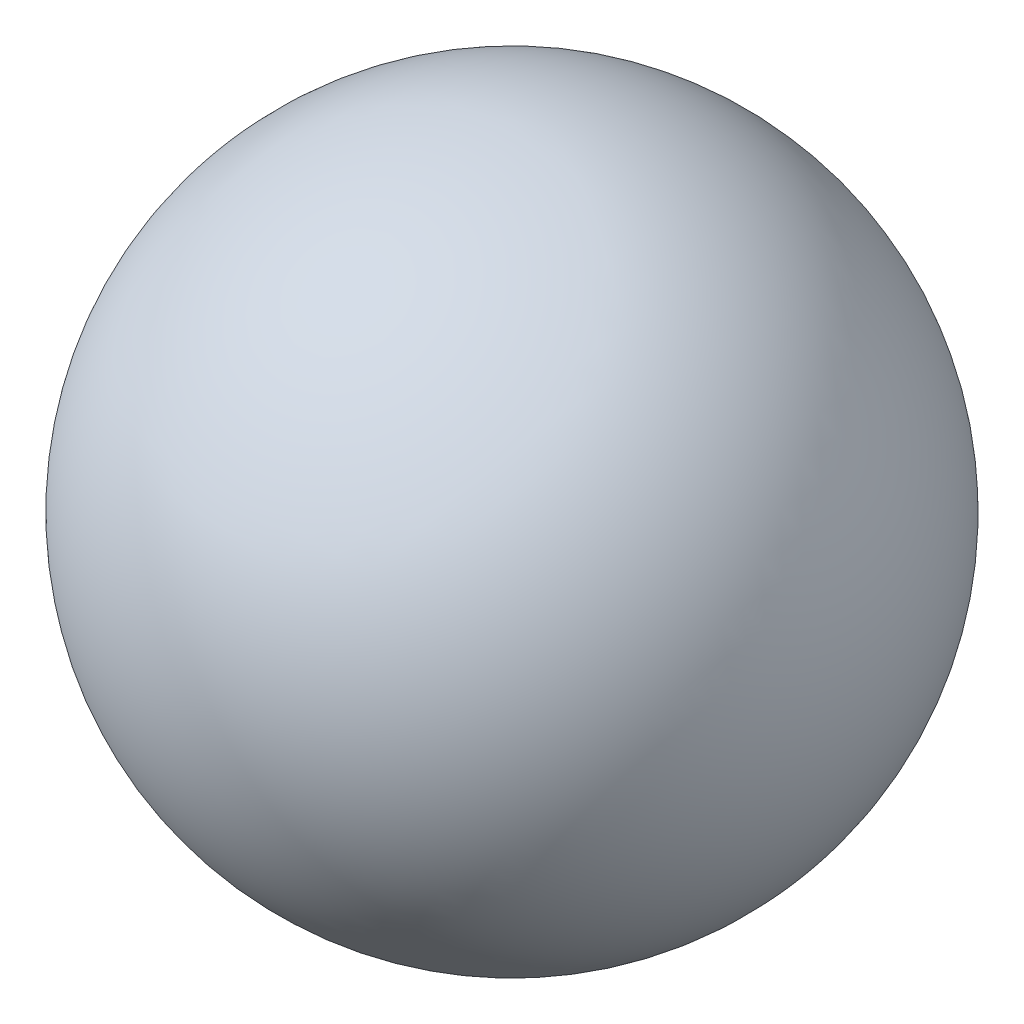
ISO-10303-21;
HEADER;
FILE_DESCRIPTION(('STEP AP214'),'2;1');
FILE_NAME('part.step','',(''),(''),'','','');
FILE_SCHEMA(('AUTOMOTIVE_DESIGN { 1 0 10303 214 1 1 1 1 }'));
ENDSEC;
DATA;
#1=APPLICATION_CONTEXT('core data for automotive mechanical design processes');
#2=APPLICATION_PROTOCOL_DEFINITION('international standard','automotive_design',2000,#1);
#3=PRODUCT_CONTEXT('',#1,'mechanical');
#4=PRODUCT('Part','Part','',(#3));
#5=PRODUCT_RELATED_PRODUCT_CATEGORY('part','',(#4));
#6=PRODUCT_DEFINITION_FORMATION('','',#4);
#7=PRODUCT_DEFINITION_CONTEXT('part definition',#1,'design');
#8=PRODUCT_DEFINITION('design','',#6,#7);
#9=PRODUCT_DEFINITION_SHAPE('','',#8);
#10=(LENGTH_UNIT() NAMED_UNIT(*) SI_UNIT(.MILLI.,.METRE.));
#11=(NAMED_UNIT(*) PLANE_ANGLE_UNIT() SI_UNIT($,.RADIAN.));
#12=(NAMED_UNIT(*) SI_UNIT($,.STERADIAN.) SOLID_ANGLE_UNIT());
#13=UNCERTAINTY_MEASURE_WITH_UNIT(LENGTH_MEASURE(1.E-05),#10,'distance_accuracy_value','');
#14=(GEOMETRIC_REPRESENTATION_CONTEXT(3) GLOBAL_UNCERTAINTY_ASSIGNED_CONTEXT((#13)) GLOBAL_UNIT_ASSIGNED_CONTEXT((#10,
#11,#12)) REPRESENTATION_CONTEXT('',''));
#15=CARTESIAN_POINT('',(0.,0.,0.));
#16=DIRECTION('',(0.,0.,1.));
#17=DIRECTION('',(1.,0.,0.));
#18=AXIS2_PLACEMENT_3D('',#15,#16,#17);
#19=CARTESIAN_POINT('',(-3.43703832126947,1.98437500000004,0.));
#20=DIRECTION('',(-0.866025403784433,0.50000000000001,0.));
#21=DIRECTION('',(0.50000000000001,0.866025403784433,0.));
#22=AXIS2_PLACEMENT_3D('',#19,#20,#21);
#23=SPHERICAL_SURFACE('',#22,0.758760243513404);
#24=CARTESIAN_POINT('',(-4.09414396753374,2.36375512175675,0.));
#25=VERTEX_POINT('',#24);
#26=VERTEX_LOOP('',#25);
#27=FACE_BOUND('',#26,.T.);
#28=ADVANCED_FACE('F34',(#27),#23,.T.);
#29=CLOSED_SHELL('',(#28));
#30=MANIFOLD_SOLID_BREP('B2',#29);
#31=ADVANCED_BREP_SHAPE_REPRESENTATION('',(#18,#30),#14);
#32=SHAPE_DEFINITION_REPRESENTATION(#9,#31);
ENDSEC;
END-ISO-10303-21;
